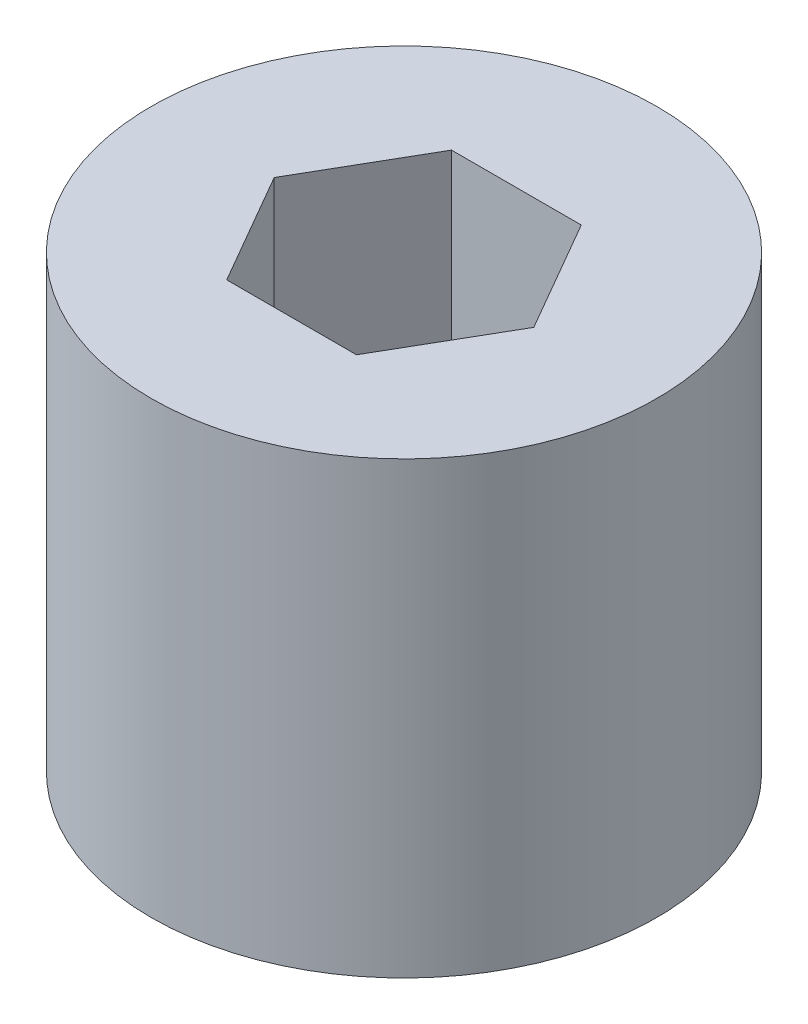
ISO-10303-21;
HEADER;
FILE_DESCRIPTION(('STEP AP214'),'2;1');
FILE_NAME('part.step','',(''),(''),'','','');
FILE_SCHEMA(('AUTOMOTIVE_DESIGN { 1 0 10303 214 1 1 1 1 }'));
ENDSEC;
DATA;
#1=APPLICATION_CONTEXT('core data for automotive mechanical design processes');
#2=APPLICATION_PROTOCOL_DEFINITION('international standard','automotive_design',2000,#1);
#3=PRODUCT_CONTEXT('',#1,'mechanical');
#4=PRODUCT('Part','Part','',(#3));
#5=PRODUCT_RELATED_PRODUCT_CATEGORY('part','',(#4));
#6=PRODUCT_DEFINITION_FORMATION('','',#4);
#7=PRODUCT_DEFINITION_CONTEXT('part definition',#1,'design');
#8=PRODUCT_DEFINITION('design','',#6,#7);
#9=PRODUCT_DEFINITION_SHAPE('','',#8);
#10=(LENGTH_UNIT() NAMED_UNIT(*) SI_UNIT(.MILLI.,.METRE.));
#11=(NAMED_UNIT(*) PLANE_ANGLE_UNIT() SI_UNIT($,.RADIAN.));
#12=(NAMED_UNIT(*) SI_UNIT($,.STERADIAN.) SOLID_ANGLE_UNIT());
#13=UNCERTAINTY_MEASURE_WITH_UNIT(LENGTH_MEASURE(1.E-05),#10,'distance_accuracy_value','');
#14=(GEOMETRIC_REPRESENTATION_CONTEXT(3) GLOBAL_UNCERTAINTY_ASSIGNED_CONTEXT((#13)) GLOBAL_UNIT_ASSIGNED_CONTEXT((#10,
#11,#12)) REPRESENTATION_CONTEXT('',''));
#15=CARTESIAN_POINT('',(0.,0.,0.));
#16=DIRECTION('',(0.,0.,1.));
#17=DIRECTION('',(1.,0.,0.));
#18=AXIS2_PLACEMENT_3D('',#15,#16,#17);
#19=CARTESIAN_POINT('',(0.,25.4,0.));
#20=DIRECTION('',(0.,1.,0.));
#21=DIRECTION('',(0.,0.,1.));
#22=AXIS2_PLACEMENT_3D('',#19,#20,#21);
#23=PLANE('',#22);
#24=CARTESIAN_POINT('',(0.,25.4,0.));
#25=DIRECTION('',(0.,1.,0.));
#26=DIRECTION('',(0.,0.,1.));
#27=AXIS2_PLACEMENT_3D('',#24,#25,#26);
#28=CIRCLE('',#27,14.2875);
#29=CARTESIAN_POINT('',(0.,25.4,14.2875));
#30=VERTEX_POINT('',#29);
#31=EDGE_CURVE('E11',#30,#30,#28,.T.);
#32=ORIENTED_EDGE('',*,*,#31,.T.);
#33=EDGE_LOOP('',(#32));
#34=FACE_BOUND('',#33,.T.);
#35=DIRECTION('',(-0.500000000000001,0.,-0.866025403784438));
#36=VECTOR('',#35,1.);
#37=CARTESIAN_POINT('',(7.33234841870825,25.4,0.));
#38=LINE('',#37,#36);
#39=CARTESIAN_POINT('',(7.33234841870825,25.4,0.));
#40=VERTEX_POINT('',#39);
#41=CARTESIAN_POINT('',(3.66617420935411,25.4,-6.35000000000001));
#42=VERTEX_POINT('',#41);
#43=EDGE_CURVE('E94',#40,#42,#38,.T.);
#44=ORIENTED_EDGE('',*,*,#43,.F.);
#45=DIRECTION('',(0.499999999999995,0.,-0.866025403784442));
#46=VECTOR('',#45,1.);
#47=CARTESIAN_POINT('',(3.6661742093542,25.4,6.34999999999996));
#48=LINE('',#47,#46);
#49=CARTESIAN_POINT('',(3.6661742093542,25.4,6.34999999999996));
#50=VERTEX_POINT('',#49);
#51=EDGE_CURVE('E86',#50,#40,#48,.T.);
#52=ORIENTED_EDGE('',*,*,#51,.F.);
#53=DIRECTION('',(1.,0.,0.));
#54=VECTOR('',#53,1.);
#55=CARTESIAN_POINT('',(-3.66617420935407,25.4,6.35000000000004));
#56=LINE('',#55,#54);
#57=CARTESIAN_POINT('',(-3.66617420935407,25.4,6.35000000000004));
#58=VERTEX_POINT('',#57);
#59=EDGE_CURVE('E114',#58,#50,#56,.T.);
#60=ORIENTED_EDGE('',*,*,#59,.F.);
#61=DIRECTION('',(0.500000000000007,0.,0.866025403784435));
#62=VECTOR('',#61,1.);
#63=CARTESIAN_POINT('',(-7.33234841870825,25.4,0.));
#64=LINE('',#63,#62);
#65=CARTESIAN_POINT('',(-7.33234841870825,25.4,0.));
#66=VERTEX_POINT('',#65);
#67=EDGE_CURVE('E112',#66,#58,#64,.T.);
#68=ORIENTED_EDGE('',*,*,#67,.F.);
#69=DIRECTION('',(-0.499999999999995,0.,0.866025403784442));
#70=VECTOR('',#69,1.);
#71=CARTESIAN_POINT('',(-3.66617420935415,25.4,-6.34999999999999));
#72=LINE('',#71,#70);
#73=CARTESIAN_POINT('',(-3.66617420935415,25.4,-6.34999999999999));
#74=VERTEX_POINT('',#73);
#75=EDGE_CURVE('E108',#74,#66,#72,.T.);
#76=ORIENTED_EDGE('',*,*,#75,.F.);
#77=DIRECTION('',(-1.,0.,0.));
#78=VECTOR('',#77,1.);
#79=CARTESIAN_POINT('',(3.66617420935411,25.4,-6.35000000000001));
#80=LINE('',#79,#78);
#81=EDGE_CURVE('E106',#42,#74,#80,.T.);
#82=ORIENTED_EDGE('',*,*,#81,.F.);
#83=EDGE_LOOP('',(#44,#52,#60,#68,#76,#82));
#84=FACE_BOUND('',#83,.T.);
#85=ADVANCED_FACE('F33',(#34,#84),#23,.T.);
#86=CARTESIAN_POINT('',(0.,0.,0.));
#87=DIRECTION('',(0.,1.,0.));
#88=DIRECTION('',(0.,0.,1.));
#89=AXIS2_PLACEMENT_3D('',#86,#87,#88);
#90=PLANE('',#89);
#91=CARTESIAN_POINT('',(0.,0.,0.));
#92=DIRECTION('',(0.,1.,0.));
#93=DIRECTION('',(0.,0.,1.));
#94=AXIS2_PLACEMENT_3D('',#91,#92,#93);
#95=CIRCLE('',#94,14.2875);
#96=CARTESIAN_POINT('',(0.,0.,14.2875));
#97=VERTEX_POINT('',#96);
#98=EDGE_CURVE('E37',#97,#97,#95,.T.);
#99=ORIENTED_EDGE('',*,*,#98,.F.);
#100=EDGE_LOOP('',(#99));
#101=FACE_BOUND('',#100,.T.);
#102=DIRECTION('',(0.499999999999995,0.,-0.866025403784442));
#103=VECTOR('',#102,1.);
#104=CARTESIAN_POINT('',(3.6661742093542,0.,6.34999999999996));
#105=LINE('',#104,#103);
#106=CARTESIAN_POINT('',(3.6661742093542,0.,6.34999999999996));
#107=VERTEX_POINT('',#106);
#108=CARTESIAN_POINT('',(7.33234841870825,0.,0.));
#109=VERTEX_POINT('',#108);
#110=EDGE_CURVE('E56',#107,#109,#105,.T.);
#111=ORIENTED_EDGE('',*,*,#110,.T.);
#112=DIRECTION('',(-0.500000000000001,0.,-0.866025403784438));
#113=VECTOR('',#112,1.);
#114=CARTESIAN_POINT('',(7.33234841870825,0.,0.));
#115=LINE('',#114,#113);
#116=CARTESIAN_POINT('',(3.66617420935411,0.,-6.35000000000001));
#117=VERTEX_POINT('',#116);
#118=EDGE_CURVE('E101',#109,#117,#115,.T.);
#119=ORIENTED_EDGE('',*,*,#118,.T.);
#120=DIRECTION('',(-1.,0.,0.));
#121=VECTOR('',#120,1.);
#122=CARTESIAN_POINT('',(3.66617420935411,0.,-6.35000000000001));
#123=LINE('',#122,#121);
#124=CARTESIAN_POINT('',(-3.66617420935415,0.,-6.34999999999999));
#125=VERTEX_POINT('',#124);
#126=EDGE_CURVE('E118',#117,#125,#123,.T.);
#127=ORIENTED_EDGE('',*,*,#126,.T.);
#128=DIRECTION('',(-0.499999999999995,0.,0.866025403784442));
#129=VECTOR('',#128,1.);
#130=CARTESIAN_POINT('',(-3.66617420935415,0.,-6.34999999999999));
#131=LINE('',#130,#129);
#132=CARTESIAN_POINT('',(-7.33234841870825,0.,0.));
#133=VERTEX_POINT('',#132);
#134=EDGE_CURVE('E121',#125,#133,#131,.T.);
#135=ORIENTED_EDGE('',*,*,#134,.T.);
#136=DIRECTION('',(0.500000000000007,0.,0.866025403784435));
#137=VECTOR('',#136,1.);
#138=CARTESIAN_POINT('',(-7.33234841870825,0.,0.));
#139=LINE('',#138,#137);
#140=CARTESIAN_POINT('',(-3.66617420935407,0.,6.35000000000004));
#141=VERTEX_POINT('',#140);
#142=EDGE_CURVE('E124',#133,#141,#139,.T.);
#143=ORIENTED_EDGE('',*,*,#142,.T.);
#144=DIRECTION('',(1.,0.,0.));
#145=VECTOR('',#144,1.);
#146=CARTESIAN_POINT('',(-3.66617420935407,0.,6.35000000000004));
#147=LINE('',#146,#145);
#148=EDGE_CURVE('E95',#141,#107,#147,.T.);
#149=ORIENTED_EDGE('',*,*,#148,.T.);
#150=EDGE_LOOP('',(#111,#119,#127,#135,#143,#149));
#151=FACE_BOUND('',#150,.T.);
#152=ADVANCED_FACE('F141',(#101,#151),#90,.F.);
#153=CARTESIAN_POINT('',(0.,25.4,0.));
#154=DIRECTION('',(0.,-1.,0.));
#155=DIRECTION('',(0.,0.,-1.));
#156=AXIS2_PLACEMENT_3D('',#153,#154,#155);
#157=CYLINDRICAL_SURFACE('',#156,14.2875);
#158=ORIENTED_EDGE('',*,*,#31,.F.);
#159=EDGE_LOOP('',(#158));
#160=FACE_BOUND('',#159,.T.);
#161=ORIENTED_EDGE('',*,*,#98,.T.);
#162=EDGE_LOOP('',(#161));
#163=FACE_BOUND('',#162,.T.);
#164=ADVANCED_FACE('F35',(#160,#163),#157,.T.);
#165=CARTESIAN_POINT('',(3.6661742093542,25.4,6.34999999999996));
#166=DIRECTION('',(-0.866025403784441,0.,-0.499999999999995));
#167=DIRECTION('',(-0.499999999999995,0.,0.866025403784442));
#168=AXIS2_PLACEMENT_3D('',#165,#166,#167);
#169=PLANE('',#168);
#170=ORIENTED_EDGE('',*,*,#110,.F.);
#171=DIRECTION('',(0.,-1.,0.));
#172=VECTOR('',#171,1.);
#173=CARTESIAN_POINT('',(3.6661742093542,25.4,6.34999999999996));
#174=LINE('',#173,#172);
#175=EDGE_CURVE('E90',#50,#107,#174,.T.);
#176=ORIENTED_EDGE('',*,*,#175,.F.);
#177=ORIENTED_EDGE('',*,*,#51,.T.);
#178=DIRECTION('',(0.,-1.,0.));
#179=VECTOR('',#178,1.);
#180=CARTESIAN_POINT('',(7.33234841870825,25.4,0.));
#181=LINE('',#180,#179);
#182=EDGE_CURVE('E89',#40,#109,#181,.T.);
#183=ORIENTED_EDGE('',*,*,#182,.T.);
#184=EDGE_LOOP('',(#170,#176,#177,#183));
#185=FACE_BOUND('',#184,.T.);
#186=ADVANCED_FACE('F88',(#185),#169,.T.);
#187=CARTESIAN_POINT('',(7.33234841870825,25.4,0.));
#188=DIRECTION('',(-0.866025403784438,0.,0.500000000000001));
#189=DIRECTION('',(0.500000000000001,0.,0.866025403784438));
#190=AXIS2_PLACEMENT_3D('',#187,#188,#189);
#191=PLANE('',#190);
#192=ORIENTED_EDGE('',*,*,#118,.F.);
#193=ORIENTED_EDGE('',*,*,#182,.F.);
#194=ORIENTED_EDGE('',*,*,#43,.T.);
#195=DIRECTION('',(0.,-1.,0.));
#196=VECTOR('',#195,1.);
#197=CARTESIAN_POINT('',(3.66617420935411,25.4,-6.35000000000001));
#198=LINE('',#197,#196);
#199=EDGE_CURVE('E102',#42,#117,#198,.T.);
#200=ORIENTED_EDGE('',*,*,#199,.T.);
#201=EDGE_LOOP('',(#192,#193,#194,#200));
#202=FACE_BOUND('',#201,.T.);
#203=ADVANCED_FACE('F98',(#202),#191,.T.);
#204=CARTESIAN_POINT('',(3.66617420935411,25.4,-6.35000000000001));
#205=DIRECTION('',(0.,0.,1.));
#206=DIRECTION('',(1.,0.,0.));
#207=AXIS2_PLACEMENT_3D('',#204,#205,#206);
#208=PLANE('',#207);
#209=ORIENTED_EDGE('',*,*,#126,.F.);
#210=ORIENTED_EDGE('',*,*,#199,.F.);
#211=ORIENTED_EDGE('',*,*,#81,.T.);
#212=DIRECTION('',(0.,-1.,0.));
#213=VECTOR('',#212,1.);
#214=CARTESIAN_POINT('',(-3.66617420935415,25.4,-6.34999999999999));
#215=LINE('',#214,#213);
#216=EDGE_CURVE('E133',#74,#125,#215,.T.);
#217=ORIENTED_EDGE('',*,*,#216,.T.);
#218=EDGE_LOOP('',(#209,#210,#211,#217));
#219=FACE_BOUND('',#218,.T.);
#220=ADVANCED_FACE('F137',(#219),#208,.T.);
#221=CARTESIAN_POINT('',(-3.66617420935415,25.4,-6.34999999999999));
#222=DIRECTION('',(0.866025403784441,0.,0.499999999999995));
#223=DIRECTION('',(0.499999999999995,0.,-0.866025403784442));
#224=AXIS2_PLACEMENT_3D('',#221,#222,#223);
#225=PLANE('',#224);
#226=ORIENTED_EDGE('',*,*,#134,.F.);
#227=ORIENTED_EDGE('',*,*,#216,.F.);
#228=ORIENTED_EDGE('',*,*,#75,.T.);
#229=DIRECTION('',(0.,-1.,0.));
#230=VECTOR('',#229,1.);
#231=CARTESIAN_POINT('',(-7.33234841870825,25.4,0.));
#232=LINE('',#231,#230);
#233=EDGE_CURVE('E131',#66,#133,#232,.T.);
#234=ORIENTED_EDGE('',*,*,#233,.T.);
#235=EDGE_LOOP('',(#226,#227,#228,#234));
#236=FACE_BOUND('',#235,.T.);
#237=ADVANCED_FACE('F149',(#236),#225,.T.);
#238=CARTESIAN_POINT('',(-7.33234841870825,25.4,0.));
#239=DIRECTION('',(0.866025403784434,0.,-0.500000000000007));
#240=DIRECTION('',(-0.500000000000007,0.,-0.866025403784435));
#241=AXIS2_PLACEMENT_3D('',#238,#239,#240);
#242=PLANE('',#241);
#243=ORIENTED_EDGE('',*,*,#142,.F.);
#244=ORIENTED_EDGE('',*,*,#233,.F.);
#245=ORIENTED_EDGE('',*,*,#67,.T.);
#246=DIRECTION('',(0.,-1.,0.));
#247=VECTOR('',#246,1.);
#248=CARTESIAN_POINT('',(-3.66617420935407,25.4,6.35000000000004));
#249=LINE('',#248,#247);
#250=EDGE_CURVE('E48',#58,#141,#249,.T.);
#251=ORIENTED_EDGE('',*,*,#250,.T.);
#252=EDGE_LOOP('',(#243,#244,#245,#251));
#253=FACE_BOUND('',#252,.T.);
#254=ADVANCED_FACE('F147',(#253),#242,.T.);
#255=CARTESIAN_POINT('',(-3.66617420935407,25.4,6.35000000000004));
#256=DIRECTION('',(0.,0.,-1.));
#257=DIRECTION('',(-1.,0.,0.));
#258=AXIS2_PLACEMENT_3D('',#255,#256,#257);
#259=PLANE('',#258);
#260=ORIENTED_EDGE('',*,*,#148,.F.);
#261=ORIENTED_EDGE('',*,*,#250,.F.);
#262=ORIENTED_EDGE('',*,*,#59,.T.);
#263=ORIENTED_EDGE('',*,*,#175,.T.);
#264=EDGE_LOOP('',(#260,#261,#262,#263));
#265=FACE_BOUND('',#264,.T.);
#266=ADVANCED_FACE('F143',(#265),#259,.T.);
#267=CLOSED_SHELL('',(#85,#152,#164,#186,#203,#220,#237,#254,#266));
#268=MANIFOLD_SOLID_BREP('B2',#267);
#269=ADVANCED_BREP_SHAPE_REPRESENTATION('',(#18,#268),#14);
#270=SHAPE_DEFINITION_REPRESENTATION(#9,#269);
ENDSEC;
END-ISO-10303-21;
